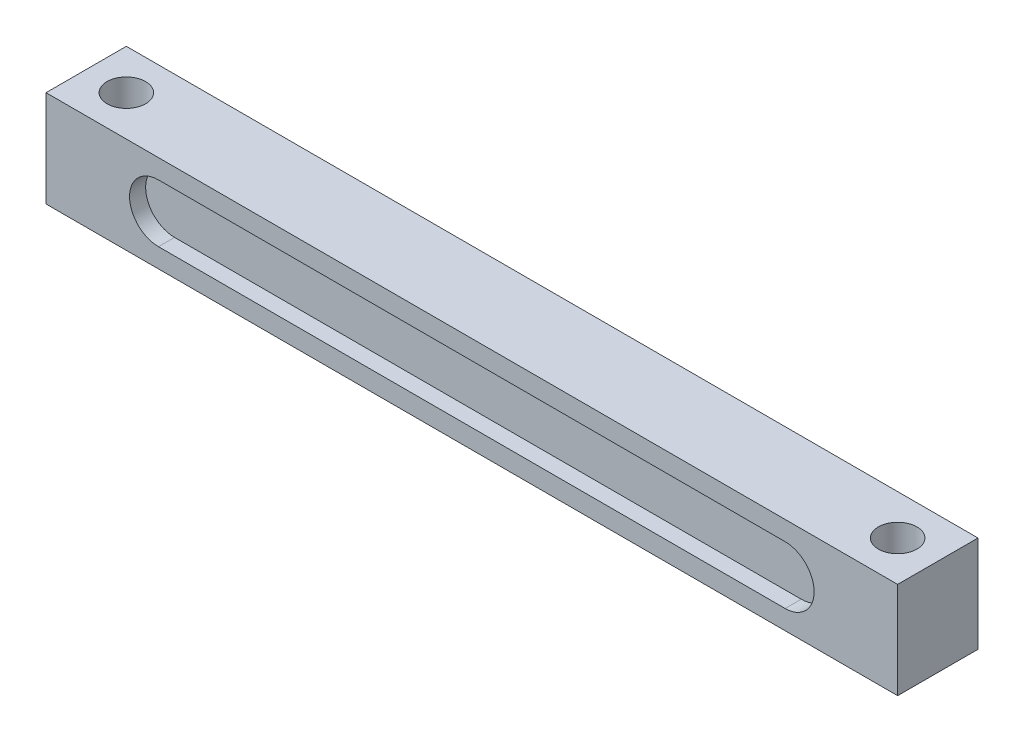
ISO-10303-21;
HEADER;
FILE_DESCRIPTION(('STEP AP214'),'2;1');
FILE_NAME('part.step','',(''),(''),'','','');
FILE_SCHEMA(('AUTOMOTIVE_DESIGN { 1 0 10303 214 1 1 1 1 }'));
ENDSEC;
DATA;
#1=APPLICATION_CONTEXT('core data for automotive mechanical design processes');
#2=APPLICATION_PROTOCOL_DEFINITION('international standard','automotive_design',2000,#1);
#3=PRODUCT_CONTEXT('',#1,'mechanical');
#4=PRODUCT('Part','Part','',(#3));
#5=PRODUCT_RELATED_PRODUCT_CATEGORY('part','',(#4));
#6=PRODUCT_DEFINITION_FORMATION('','',#4);
#7=PRODUCT_DEFINITION_CONTEXT('part definition',#1,'design');
#8=PRODUCT_DEFINITION('design','',#6,#7);
#9=PRODUCT_DEFINITION_SHAPE('','',#8);
#10=(LENGTH_UNIT() NAMED_UNIT(*) SI_UNIT(.MILLI.,.METRE.));
#11=(NAMED_UNIT(*) PLANE_ANGLE_UNIT() SI_UNIT($,.RADIAN.));
#12=(NAMED_UNIT(*) SI_UNIT($,.STERADIAN.) SOLID_ANGLE_UNIT());
#13=UNCERTAINTY_MEASURE_WITH_UNIT(LENGTH_MEASURE(1.E-05),#10,'distance_accuracy_value','');
#14=(GEOMETRIC_REPRESENTATION_CONTEXT(3) GLOBAL_UNCERTAINTY_ASSIGNED_CONTEXT((#13)) GLOBAL_UNIT_ASSIGNED_CONTEXT((#10,
#11,#12)) REPRESENTATION_CONTEXT('',''));
#15=CARTESIAN_POINT('',(0.,0.,0.));
#16=DIRECTION('',(0.,0.,1.));
#17=DIRECTION('',(1.,0.,0.));
#18=AXIS2_PLACEMENT_3D('',#15,#16,#17);
#19=CARTESIAN_POINT('',(0.,0.,0.));
#20=DIRECTION('',(0.,-1.,0.));
#21=DIRECTION('',(0.,0.,-1.));
#22=AXIS2_PLACEMENT_3D('',#19,#20,#21);
#23=PLANE('',#22);
#24=DIRECTION('',(-1.,0.,0.));
#25=VECTOR('',#24,1.);
#26=CARTESIAN_POINT('',(0.,0.,-31.75));
#27=LINE('',#26,#25);
#28=CARTESIAN_POINT('',(152.4,0.,-31.75));
#29=VERTEX_POINT('',#28);
#30=CARTESIAN_POINT('',(15.875,0.,-31.75));
#31=VERTEX_POINT('',#30);
#32=EDGE_CURVE('E274',#29,#31,#27,.T.);
#33=ORIENTED_EDGE('',*,*,#32,.F.);
#34=DIRECTION('',(0.,0.,1.));
#35=VECTOR('',#34,1.);
#36=CARTESIAN_POINT('',(152.4,0.,0.));
#37=LINE('',#36,#35);
#38=CARTESIAN_POINT('',(152.4,0.,0.));
#39=VERTEX_POINT('',#38);
#40=EDGE_CURVE('E11',#29,#39,#37,.T.);
#41=ORIENTED_EDGE('',*,*,#40,.T.);
#42=DIRECTION('',(1.,0.,0.));
#43=VECTOR('',#42,1.);
#44=CARTESIAN_POINT('',(0.,0.,0.));
#45=LINE('',#44,#43);
#46=CARTESIAN_POINT('',(15.875,0.,0.));
#47=VERTEX_POINT('',#46);
#48=EDGE_CURVE('E266',#47,#39,#45,.T.);
#49=ORIENTED_EDGE('',*,*,#48,.F.);
#50=CARTESIAN_POINT('',(15.875,0.,-15.875));
#51=DIRECTION('',(0.,-1.,0.));
#52=DIRECTION('',(0.,0.,-1.));
#53=AXIS2_PLACEMENT_3D('',#50,#51,#52);
#54=CIRCLE('',#53,15.875);
#55=EDGE_CURVE('E290',#47,#31,#54,.F.);
#56=ORIENTED_EDGE('',*,*,#55,.T.);
#57=EDGE_LOOP('',(#33,#41,#49,#56));
#58=FACE_BOUND('',#57,.T.);
#59=ADVANCED_FACE('F50',(#58),#23,.T.);
#60=CARTESIAN_POINT('',(184.15,0.,0.));
#61=VERTEX_POINT('',#60);
#62=CARTESIAN_POINT('',(320.675,0.,0.));
#63=VERTEX_POINT('',#62);
#64=EDGE_CURVE('E270',#61,#63,#45,.T.);
#65=ORIENTED_EDGE('',*,*,#64,.F.);
#66=DIRECTION('',(0.,0.,-1.));
#67=VECTOR('',#66,1.);
#68=CARTESIAN_POINT('',(184.15,0.,0.));
#69=LINE('',#68,#67);
#70=CARTESIAN_POINT('',(184.15,0.,-31.75));
#71=VERTEX_POINT('',#70);
#72=EDGE_CURVE('E57',#61,#71,#69,.T.);
#73=ORIENTED_EDGE('',*,*,#72,.T.);
#74=CARTESIAN_POINT('',(320.675,0.,-31.75));
#75=VERTEX_POINT('',#74);
#76=EDGE_CURVE('E273',#75,#71,#27,.T.);
#77=ORIENTED_EDGE('',*,*,#76,.F.);
#78=CARTESIAN_POINT('',(320.675,0.,-15.875));
#79=DIRECTION('',(0.,-1.,0.));
#80=DIRECTION('',(0.,0.,-1.));
#81=AXIS2_PLACEMENT_3D('',#78,#79,#80);
#82=CIRCLE('',#81,15.875);
#83=EDGE_CURVE('E299',#75,#63,#82,.F.);
#84=ORIENTED_EDGE('',*,*,#83,.T.);
#85=EDGE_LOOP('',(#65,#73,#77,#84));
#86=FACE_BOUND('',#85,.T.);
#87=ADVANCED_FACE('F344',(#86),#23,.T.);
#88=ORIENTED_EDGE('',*,*,#40,.F.);
#89=EDGE_CURVE('E342',#71,#29,#27,.T.);
#90=ORIENTED_EDGE('',*,*,#89,.F.);
#91=ORIENTED_EDGE('',*,*,#72,.F.);
#92=EDGE_CURVE('E333',#39,#61,#45,.T.);
#93=ORIENTED_EDGE('',*,*,#92,.F.);
#94=EDGE_LOOP('',(#88,#90,#91,#93));
#95=FACE_BOUND('',#94,.T.);
#96=ADVANCED_FACE('F336',(#95),#23,.T.);
#97=CARTESIAN_POINT('',(336.55,0.,0.));
#98=VERTEX_POINT('',#97);
#99=EDGE_CURVE('E261',#63,#98,#45,.T.);
#100=ORIENTED_EDGE('',*,*,#99,.F.);
#101=CARTESIAN_POINT('',(336.55,0.,-15.875));
#102=VERTEX_POINT('',#101);
#103=EDGE_CURVE('E298',#63,#102,#82,.F.);
#104=ORIENTED_EDGE('',*,*,#103,.T.);
#105=DIRECTION('',(0.,0.,-1.));
#106=VECTOR('',#105,1.);
#107=CARTESIAN_POINT('',(336.55,0.,0.));
#108=LINE('',#107,#106);
#109=EDGE_CURVE('E268',#98,#102,#108,.T.);
#110=ORIENTED_EDGE('',*,*,#109,.F.);
#111=EDGE_LOOP('',(#100,#104,#110));
#112=FACE_BOUND('',#111,.T.);
#113=ADVANCED_FACE('F317',(#112),#23,.T.);
#114=CARTESIAN_POINT('',(336.55,0.,-31.75));
#115=VERTEX_POINT('',#114);
#116=EDGE_CURVE('E264',#102,#115,#108,.T.);
#117=ORIENTED_EDGE('',*,*,#116,.F.);
#118=EDGE_CURVE('E291',#102,#75,#82,.F.);
#119=ORIENTED_EDGE('',*,*,#118,.T.);
#120=EDGE_CURVE('E253',#115,#75,#27,.T.);
#121=ORIENTED_EDGE('',*,*,#120,.F.);
#122=EDGE_LOOP('',(#117,#119,#121));
#123=FACE_BOUND('',#122,.T.);
#124=ADVANCED_FACE('F326',(#123),#23,.T.);
#125=CARTESIAN_POINT('',(0.,0.,-31.75));
#126=VERTEX_POINT('',#125);
#127=EDGE_CURVE('E271',#31,#126,#27,.T.);
#128=ORIENTED_EDGE('',*,*,#127,.F.);
#129=CARTESIAN_POINT('',(0.,0.,-15.875));
#130=VERTEX_POINT('',#129);
#131=EDGE_CURVE('E295',#31,#130,#54,.F.);
#132=ORIENTED_EDGE('',*,*,#131,.T.);
#133=DIRECTION('',(0.,0.,1.));
#134=VECTOR('',#133,1.);
#135=CARTESIAN_POINT('',(0.,0.,0.));
#136=LINE('',#135,#134);
#137=EDGE_CURVE('E256',#126,#130,#136,.T.);
#138=ORIENTED_EDGE('',*,*,#137,.F.);
#139=EDGE_LOOP('',(#128,#132,#138));
#140=FACE_BOUND('',#139,.T.);
#141=ADVANCED_FACE('F421',(#140),#23,.T.);
#142=CARTESIAN_POINT('',(0.,0.,0.));
#143=VERTEX_POINT('',#142);
#144=EDGE_CURVE('E245',#130,#143,#136,.T.);
#145=ORIENTED_EDGE('',*,*,#144,.F.);
#146=EDGE_CURVE('E292',#130,#47,#54,.F.);
#147=ORIENTED_EDGE('',*,*,#146,.T.);
#148=EDGE_CURVE('E265',#143,#47,#45,.T.);
#149=ORIENTED_EDGE('',*,*,#148,.F.);
#150=EDGE_LOOP('',(#145,#147,#149));
#151=FACE_BOUND('',#150,.T.);
#152=ADVANCED_FACE('F420',(#151),#23,.T.);
#153=ORIENTED_EDGE('',*,*,#83,.F.);
#154=ORIENTED_EDGE('',*,*,#118,.F.);
#155=ORIENTED_EDGE('',*,*,#103,.F.);
#156=EDGE_LOOP('',(#153,#154,#155));
#157=FACE_BOUND('',#156,.T.);
#158=CARTESIAN_POINT('',(320.675,0.,-15.875));
#159=DIRECTION('',(0.,1.,0.));
#160=DIRECTION('',(0.,0.,1.));
#161=AXIS2_PLACEMENT_3D('',#158,#159,#160);
#162=CIRCLE('',#161,7.62000000000003);
#163=CARTESIAN_POINT('',(320.675,0.,-23.495));
#164=VERTEX_POINT('',#163);
#165=EDGE_CURVE('E230',#164,#164,#162,.T.);
#166=ORIENTED_EDGE('',*,*,#165,.T.);
#167=EDGE_LOOP('',(#166));
#168=FACE_BOUND('',#167,.T.);
#169=ADVANCED_FACE('F325',(#157,#168),#23,.T.);
#170=CARTESIAN_POINT('',(0.,38.1,0.));
#171=DIRECTION('',(0.,-1.,0.));
#172=DIRECTION('',(0.,0.,-1.));
#173=AXIS2_PLACEMENT_3D('',#170,#171,#172);
#174=PLANE('',#173);
#175=DIRECTION('',(0.,0.,1.));
#176=VECTOR('',#175,1.);
#177=CARTESIAN_POINT('',(0.,38.1,0.));
#178=LINE('',#177,#176);
#179=CARTESIAN_POINT('',(0.,38.1,-31.75));
#180=VERTEX_POINT('',#179);
#181=CARTESIAN_POINT('',(0.,38.1,0.));
#182=VERTEX_POINT('',#181);
#183=EDGE_CURVE('E250',#180,#182,#178,.T.);
#184=ORIENTED_EDGE('',*,*,#183,.T.);
#185=DIRECTION('',(1.,0.,0.));
#186=VECTOR('',#185,1.);
#187=CARTESIAN_POINT('',(0.,38.1,0.));
#188=LINE('',#187,#186);
#189=CARTESIAN_POINT('',(336.55,38.1,0.));
#190=VERTEX_POINT('',#189);
#191=EDGE_CURVE('E249',#182,#190,#188,.T.);
#192=ORIENTED_EDGE('',*,*,#191,.T.);
#193=DIRECTION('',(0.,0.,-1.));
#194=VECTOR('',#193,1.);
#195=CARTESIAN_POINT('',(336.55,38.1,0.));
#196=LINE('',#195,#194);
#197=CARTESIAN_POINT('',(336.55,38.1,-31.75));
#198=VERTEX_POINT('',#197);
#199=EDGE_CURVE('E251',#190,#198,#196,.T.);
#200=ORIENTED_EDGE('',*,*,#199,.T.);
#201=DIRECTION('',(-1.,0.,0.));
#202=VECTOR('',#201,1.);
#203=CARTESIAN_POINT('',(0.,38.1,-31.75));
#204=LINE('',#203,#202);
#205=EDGE_CURVE('E254',#198,#180,#204,.T.);
#206=ORIENTED_EDGE('',*,*,#205,.T.);
#207=EDGE_LOOP('',(#184,#192,#200,#206));
#208=FACE_BOUND('',#207,.T.);
#209=CARTESIAN_POINT('',(15.875,38.1,-15.875));
#210=DIRECTION('',(0.,1.,0.));
#211=DIRECTION('',(0.,0.,1.));
#212=AXIS2_PLACEMENT_3D('',#209,#210,#211);
#213=CIRCLE('',#212,7.62);
#214=CARTESIAN_POINT('',(15.875,38.1,-23.495));
#215=VERTEX_POINT('',#214);
#216=EDGE_CURVE('E243',#215,#215,#213,.T.);
#217=ORIENTED_EDGE('',*,*,#216,.F.);
#218=EDGE_LOOP('',(#217));
#219=FACE_BOUND('',#218,.T.);
#220=CARTESIAN_POINT('',(320.675,38.1,-15.875));
#221=DIRECTION('',(0.,1.,0.));
#222=DIRECTION('',(0.,0.,1.));
#223=AXIS2_PLACEMENT_3D('',#220,#221,#222);
#224=CIRCLE('',#223,7.62000000000003);
#225=CARTESIAN_POINT('',(320.675,38.1,-23.495));
#226=VERTEX_POINT('',#225);
#227=EDGE_CURVE('E234',#226,#226,#224,.T.);
#228=ORIENTED_EDGE('',*,*,#227,.F.);
#229=EDGE_LOOP('',(#228));
#230=FACE_BOUND('',#229,.T.);
#231=ADVANCED_FACE('F360',(#208,#219,#230),#174,.F.);
#232=ORIENTED_EDGE('',*,*,#131,.F.);
#233=ORIENTED_EDGE('',*,*,#55,.F.);
#234=ORIENTED_EDGE('',*,*,#146,.F.);
#235=EDGE_LOOP('',(#232,#233,#234));
#236=FACE_BOUND('',#235,.T.);
#237=CARTESIAN_POINT('',(15.875,0.,-15.875));
#238=DIRECTION('',(0.,1.,0.));
#239=DIRECTION('',(0.,0.,1.));
#240=AXIS2_PLACEMENT_3D('',#237,#238,#239);
#241=CIRCLE('',#240,7.62);
#242=CARTESIAN_POINT('',(15.875,0.,-23.495));
#243=VERTEX_POINT('',#242);
#244=EDGE_CURVE('E236',#243,#243,#241,.T.);
#245=ORIENTED_EDGE('',*,*,#244,.T.);
#246=EDGE_LOOP('',(#245));
#247=FACE_BOUND('',#246,.T.);
#248=ADVANCED_FACE('F352',(#236,#247),#23,.T.);
#249=CARTESIAN_POINT('',(0.,38.1,0.));
#250=DIRECTION('',(1.,0.,0.));
#251=DIRECTION('',(0.,0.,-1.));
#252=AXIS2_PLACEMENT_3D('',#249,#250,#251);
#253=PLANE('',#252);
#254=ORIENTED_EDGE('',*,*,#137,.T.);
#255=ORIENTED_EDGE('',*,*,#144,.T.);
#256=DIRECTION('',(0.,-1.,0.));
#257=VECTOR('',#256,1.);
#258=CARTESIAN_POINT('',(0.,38.1,0.));
#259=LINE('',#258,#257);
#260=EDGE_CURVE('E285',#182,#143,#259,.T.);
#261=ORIENTED_EDGE('',*,*,#260,.F.);
#262=ORIENTED_EDGE('',*,*,#183,.F.);
#263=DIRECTION('',(0.,-1.,0.));
#264=VECTOR('',#263,1.);
#265=CARTESIAN_POINT('',(0.,38.1,-31.75));
#266=LINE('',#265,#264);
#267=EDGE_CURVE('E260',#180,#126,#266,.T.);
#268=ORIENTED_EDGE('',*,*,#267,.T.);
#269=EDGE_LOOP('',(#254,#255,#261,#262,#268));
#270=FACE_BOUND('',#269,.T.);
#271=ADVANCED_FACE('F47',(#270),#253,.F.);
#272=CARTESIAN_POINT('',(0.,38.1,0.));
#273=DIRECTION('',(0.,0.,-1.));
#274=DIRECTION('',(-1.,0.,0.));
#275=AXIS2_PLACEMENT_3D('',#272,#273,#274);
#276=PLANE('',#275);
#277=DIRECTION('',(1.,0.,0.));
#278=VECTOR('',#277,1.);
#279=CARTESIAN_POINT('',(44.45,7.62,0.));
#280=LINE('',#279,#278);
#281=CARTESIAN_POINT('',(44.45,7.62,0.));
#282=VERTEX_POINT('',#281);
#283=CARTESIAN_POINT('',(292.1,7.62,0.));
#284=VERTEX_POINT('',#283);
#285=EDGE_CURVE('E218',#282,#284,#280,.T.);
#286=ORIENTED_EDGE('',*,*,#285,.F.);
#287=CARTESIAN_POINT('',(44.45,19.05,0.));
#288=DIRECTION('',(0.,0.,1.));
#289=DIRECTION('',(1.,0.,0.));
#290=AXIS2_PLACEMENT_3D('',#287,#288,#289);
#291=CIRCLE('',#290,11.43);
#292=CARTESIAN_POINT('',(44.45,30.48,0.));
#293=VERTEX_POINT('',#292);
#294=EDGE_CURVE('E72',#293,#282,#291,.T.);
#295=ORIENTED_EDGE('',*,*,#294,.F.);
#296=DIRECTION('',(-1.,0.,0.));
#297=VECTOR('',#296,1.);
#298=CARTESIAN_POINT('',(44.45,30.48,0.));
#299=LINE('',#298,#297);
#300=CARTESIAN_POINT('',(292.1,30.48,0.));
#301=VERTEX_POINT('',#300);
#302=EDGE_CURVE('E208',#301,#293,#299,.T.);
#303=ORIENTED_EDGE('',*,*,#302,.F.);
#304=CARTESIAN_POINT('',(292.1,19.05,0.));
#305=DIRECTION('',(0.,0.,1.));
#306=DIRECTION('',(1.,0.,0.));
#307=AXIS2_PLACEMENT_3D('',#304,#305,#306);
#308=CIRCLE('',#307,11.43);
#309=EDGE_CURVE('E225',#284,#301,#308,.T.);
#310=ORIENTED_EDGE('',*,*,#309,.F.);
#311=EDGE_LOOP('',(#286,#295,#303,#310));
#312=FACE_BOUND('',#311,.T.);
#313=ORIENTED_EDGE('',*,*,#148,.T.);
#314=ORIENTED_EDGE('',*,*,#48,.T.);
#315=ORIENTED_EDGE('',*,*,#92,.T.);
#316=ORIENTED_EDGE('',*,*,#64,.T.);
#317=ORIENTED_EDGE('',*,*,#99,.T.);
#318=DIRECTION('',(0.,-1.,0.));
#319=VECTOR('',#318,1.);
#320=CARTESIAN_POINT('',(336.55,38.1,0.));
#321=LINE('',#320,#319);
#322=EDGE_CURVE('E283',#190,#98,#321,.T.);
#323=ORIENTED_EDGE('',*,*,#322,.F.);
#324=ORIENTED_EDGE('',*,*,#191,.F.);
#325=ORIENTED_EDGE('',*,*,#260,.T.);
#326=EDGE_LOOP('',(#313,#314,#315,#316,#317,#323,#324,#325));
#327=FACE_BOUND('',#326,.T.);
#328=ADVANCED_FACE('F334',(#312,#327),#276,.F.);
#329=CARTESIAN_POINT('',(336.55,38.1,0.));
#330=DIRECTION('',(-1.,0.,0.));
#331=DIRECTION('',(0.,0.,1.));
#332=AXIS2_PLACEMENT_3D('',#329,#330,#331);
#333=PLANE('',#332);
#334=ORIENTED_EDGE('',*,*,#109,.T.);
#335=ORIENTED_EDGE('',*,*,#116,.T.);
#336=DIRECTION('',(0.,-1.,0.));
#337=VECTOR('',#336,1.);
#338=CARTESIAN_POINT('',(336.55,38.1,-31.75));
#339=LINE('',#338,#337);
#340=EDGE_CURVE('E279',#198,#115,#339,.T.);
#341=ORIENTED_EDGE('',*,*,#340,.F.);
#342=ORIENTED_EDGE('',*,*,#199,.F.);
#343=ORIENTED_EDGE('',*,*,#322,.T.);
#344=EDGE_LOOP('',(#334,#335,#341,#342,#343));
#345=FACE_BOUND('',#344,.T.);
#346=ADVANCED_FACE('F328',(#345),#333,.F.);
#347=CARTESIAN_POINT('',(0.,38.1,-31.75));
#348=DIRECTION('',(0.,0.,1.));
#349=DIRECTION('',(1.,0.,0.));
#350=AXIS2_PLACEMENT_3D('',#347,#348,#349);
#351=PLANE('',#350);
#352=DIRECTION('',(-1.,0.,0.));
#353=VECTOR('',#352,1.);
#354=CARTESIAN_POINT('',(292.1,7.62,-31.75));
#355=LINE('',#354,#353);
#356=CARTESIAN_POINT('',(292.1,7.62,-31.75));
#357=VERTEX_POINT('',#356);
#358=CARTESIAN_POINT('',(44.45,7.62,-31.75));
#359=VERTEX_POINT('',#358);
#360=EDGE_CURVE('E194',#357,#359,#355,.T.);
#361=ORIENTED_EDGE('',*,*,#360,.F.);
#362=CARTESIAN_POINT('',(292.1,19.05,-31.75));
#363=DIRECTION('',(0.,0.,-1.));
#364=DIRECTION('',(-1.,0.,0.));
#365=AXIS2_PLACEMENT_3D('',#362,#363,#364);
#366=CIRCLE('',#365,11.43);
#367=CARTESIAN_POINT('',(292.1,30.48,-31.75));
#368=VERTEX_POINT('',#367);
#369=EDGE_CURVE('E62',#368,#357,#366,.T.);
#370=ORIENTED_EDGE('',*,*,#369,.F.);
#371=DIRECTION('',(1.,0.,0.));
#372=VECTOR('',#371,1.);
#373=CARTESIAN_POINT('',(292.1,30.48,-31.75));
#374=LINE('',#373,#372);
#375=CARTESIAN_POINT('',(44.45,30.48,-31.75));
#376=VERTEX_POINT('',#375);
#377=EDGE_CURVE('E188',#376,#368,#374,.T.);
#378=ORIENTED_EDGE('',*,*,#377,.F.);
#379=CARTESIAN_POINT('',(44.45,19.05,-31.75));
#380=DIRECTION('',(0.,0.,-1.));
#381=DIRECTION('',(-1.,0.,0.));
#382=AXIS2_PLACEMENT_3D('',#379,#380,#381);
#383=CIRCLE('',#382,11.43);
#384=EDGE_CURVE('E190',#359,#376,#383,.T.);
#385=ORIENTED_EDGE('',*,*,#384,.F.);
#386=EDGE_LOOP('',(#361,#370,#378,#385));
#387=FACE_BOUND('',#386,.T.);
#388=ORIENTED_EDGE('',*,*,#120,.T.);
#389=ORIENTED_EDGE('',*,*,#76,.T.);
#390=ORIENTED_EDGE('',*,*,#89,.T.);
#391=ORIENTED_EDGE('',*,*,#32,.T.);
#392=ORIENTED_EDGE('',*,*,#127,.T.);
#393=ORIENTED_EDGE('',*,*,#267,.F.);
#394=ORIENTED_EDGE('',*,*,#205,.F.);
#395=ORIENTED_EDGE('',*,*,#340,.T.);
#396=EDGE_LOOP('',(#388,#389,#390,#391,#392,#393,#394,#395));
#397=FACE_BOUND('',#396,.T.);
#398=ADVANCED_FACE('F359',(#387,#397),#351,.F.);
#399=CARTESIAN_POINT('',(15.875,38.1,-15.875));
#400=DIRECTION('',(0.,-1.,0.));
#401=DIRECTION('',(0.,0.,-1.));
#402=AXIS2_PLACEMENT_3D('',#399,#400,#401);
#403=CYLINDRICAL_SURFACE('',#402,7.62);
#404=CARTESIAN_POINT('',(15.875,38.1,-23.495));
#405=CARTESIAN_POINT('',(15.875,37.703125,-23.495));
#406=CARTESIAN_POINT('',(15.875,37.30625,-23.495));
#407=CARTESIAN_POINT('',(15.875,36.5125,-23.495));
#408=CARTESIAN_POINT('',(15.875,36.115625,-23.495));
#409=CARTESIAN_POINT('',(15.875,35.321875,-23.495));
#410=CARTESIAN_POINT('',(15.875,34.925,-23.495));
#411=CARTESIAN_POINT('',(15.875,34.13125,-23.495));
#412=CARTESIAN_POINT('',(15.875,33.734375,-23.495));
#413=CARTESIAN_POINT('',(15.875,32.940625,-23.495));
#414=CARTESIAN_POINT('',(15.875,32.54375,-23.495));
#415=CARTESIAN_POINT('',(15.875,31.75,-23.495));
#416=CARTESIAN_POINT('',(15.875,31.353125,-23.495));
#417=CARTESIAN_POINT('',(15.875,30.559375,-23.495));
#418=CARTESIAN_POINT('',(15.875,30.1625,-23.495));
#419=CARTESIAN_POINT('',(15.875,29.36875,-23.495));
#420=CARTESIAN_POINT('',(15.875,28.971875,-23.495));
#421=CARTESIAN_POINT('',(15.875,28.178125,-23.495));
#422=CARTESIAN_POINT('',(15.875,27.78125,-23.495));
#423=CARTESIAN_POINT('',(15.875,26.9875,-23.495));
#424=CARTESIAN_POINT('',(15.875,26.590625,-23.495));
#425=CARTESIAN_POINT('',(15.875,25.796875,-23.495));
#426=CARTESIAN_POINT('',(15.875,25.4,-23.495));
#427=CARTESIAN_POINT('',(15.875,24.60625,-23.495));
#428=CARTESIAN_POINT('',(15.875,24.209375,-23.495));
#429=CARTESIAN_POINT('',(15.875,23.415625,-23.495));
#430=CARTESIAN_POINT('',(15.875,23.01875,-23.495));
#431=CARTESIAN_POINT('',(15.875,22.225,-23.495));
#432=CARTESIAN_POINT('',(15.875,21.828125,-23.495));
#433=CARTESIAN_POINT('',(15.875,21.034375,-23.495));
#434=CARTESIAN_POINT('',(15.875,20.6375,-23.495));
#435=CARTESIAN_POINT('',(15.875,19.84375,-23.495));
#436=CARTESIAN_POINT('',(15.875,19.446875,-23.495));
#437=CARTESIAN_POINT('',(15.875,18.653125,-23.495));
#438=CARTESIAN_POINT('',(15.875,18.25625,-23.495));
#439=CARTESIAN_POINT('',(15.875,17.4625,-23.495));
#440=CARTESIAN_POINT('',(15.875,17.065625,-23.495));
#441=CARTESIAN_POINT('',(15.875,16.271875,-23.495));
#442=CARTESIAN_POINT('',(15.875,15.875,-23.495));
#443=CARTESIAN_POINT('',(15.875,15.08125,-23.495));
#444=CARTESIAN_POINT('',(15.875,14.684375,-23.495));
#445=CARTESIAN_POINT('',(15.875,13.890625,-23.495));
#446=CARTESIAN_POINT('',(15.875,13.49375,-23.495));
#447=CARTESIAN_POINT('',(15.875,12.7,-23.495));
#448=CARTESIAN_POINT('',(15.875,12.303125,-23.495));
#449=CARTESIAN_POINT('',(15.875,11.509375,-23.495));
#450=CARTESIAN_POINT('',(15.875,11.1125,-23.495));
#451=CARTESIAN_POINT('',(15.875,10.31875,-23.495));
#452=CARTESIAN_POINT('',(15.875,9.92187499999999,-23.495));
#453=CARTESIAN_POINT('',(15.875,9.128125,-23.495));
#454=CARTESIAN_POINT('',(15.875,8.73124999999999,-23.495));
#455=CARTESIAN_POINT('',(15.875,7.93749999999999,-23.495));
#456=CARTESIAN_POINT('',(15.875,7.54062499999999,-23.495));
#457=CARTESIAN_POINT('',(15.875,6.746875,-23.495));
#458=CARTESIAN_POINT('',(15.875,6.35,-23.495));
#459=CARTESIAN_POINT('',(15.875,5.55625,-23.495));
#460=CARTESIAN_POINT('',(15.875,5.159375,-23.495));
#461=CARTESIAN_POINT('',(15.875,4.365625,-23.495));
#462=CARTESIAN_POINT('',(15.875,3.96875,-23.495));
#463=CARTESIAN_POINT('',(15.875,3.175,-23.495));
#464=CARTESIAN_POINT('',(15.875,2.778125,-23.495));
#465=CARTESIAN_POINT('',(15.875,1.984375,-23.495));
#466=CARTESIAN_POINT('',(15.875,1.5875,-23.495));
#467=CARTESIAN_POINT('',(15.875,0.79375,-23.495));
#468=CARTESIAN_POINT('',(15.875,0.396875,-23.495));
#469=CARTESIAN_POINT('',(15.875,0.,-23.495));
#470=B_SPLINE_CURVE_WITH_KNOTS('',3,(#404,#405,#406,#407,#408,#409,#410,#411,#412,#413,#414,
#415,#416,#417,#418,#419,#420,#421,#422,#423,#424,#425,#426,#427,#428,#429,#430,#431,#432,#433,
#434,#435,#436,#437,#438,#439,#440,#441,#442,#443,#444,#445,#446,#447,#448,#449,#450,#451,#452,
#453,#454,#455,#456,#457,#458,#459,#460,#461,#462,#463,#464,#465,#466,#467,#468,#469),
.UNSPECIFIED.,.F.,.F.,(4,2,2,2,2,2,2,2,2,2,2,2,2,2,2,2,2,2,2,2,2,2,2,2,2,2,2,2,2,2,2,2,4),(0.,
1.190625,2.38125,3.571875,4.7625,5.953125,7.14375,8.334375,9.52500000000001,10.715625,11.90625,
13.096875,14.2875,15.478125,16.66875,17.859375,19.05,20.240625,21.43125,22.621875,23.8125,
25.003125,26.19375,27.384375,28.575,29.765625,30.95625,32.146875,33.3375,34.528125,35.71875,
36.909375,38.1),.UNSPECIFIED.);
#471=EDGE_CURVE('BSEAM361',#215,#243,#470,.T.);
#472=ORIENTED_EDGE('',*,*,#216,.T.);
#473=ORIENTED_EDGE('',*,*,#244,.F.);
#474=ORIENTED_EDGE('',*,*,#471,.T.);
#475=ORIENTED_EDGE('',*,*,#471,.F.);
#476=EDGE_LOOP('',(#472,#474,#473,#475));
#477=FACE_BOUND('',#476,.T.);
#478=ADVANCED_FACE('F361',(#477),#403,.F.);
#479=CARTESIAN_POINT('',(320.675,38.1,-15.875));
#480=DIRECTION('',(0.,-1.,0.));
#481=DIRECTION('',(0.,0.,-1.));
#482=AXIS2_PLACEMENT_3D('',#479,#480,#481);
#483=CYLINDRICAL_SURFACE('',#482,7.62000000000003);
#484=CARTESIAN_POINT('',(320.675,38.1,-23.495));
#485=CARTESIAN_POINT('',(320.675,37.703125,-23.495));
#486=CARTESIAN_POINT('',(320.675,37.30625,-23.495));
#487=CARTESIAN_POINT('',(320.675,36.5125,-23.495));
#488=CARTESIAN_POINT('',(320.675,36.115625,-23.495));
#489=CARTESIAN_POINT('',(320.675,35.321875,-23.495));
#490=CARTESIAN_POINT('',(320.675,34.925,-23.495));
#491=CARTESIAN_POINT('',(320.675,34.13125,-23.495));
#492=CARTESIAN_POINT('',(320.675,33.734375,-23.495));
#493=CARTESIAN_POINT('',(320.675,32.940625,-23.495));
#494=CARTESIAN_POINT('',(320.675,32.54375,-23.495));
#495=CARTESIAN_POINT('',(320.675,31.75,-23.495));
#496=CARTESIAN_POINT('',(320.675,31.353125,-23.495));
#497=CARTESIAN_POINT('',(320.675,30.559375,-23.495));
#498=CARTESIAN_POINT('',(320.675,30.1625,-23.495));
#499=CARTESIAN_POINT('',(320.675,29.36875,-23.495));
#500=CARTESIAN_POINT('',(320.675,28.971875,-23.495));
#501=CARTESIAN_POINT('',(320.675,28.178125,-23.495));
#502=CARTESIAN_POINT('',(320.675,27.78125,-23.495));
#503=CARTESIAN_POINT('',(320.675,26.9875,-23.495));
#504=CARTESIAN_POINT('',(320.675,26.590625,-23.495));
#505=CARTESIAN_POINT('',(320.675,25.796875,-23.495));
#506=CARTESIAN_POINT('',(320.675,25.4,-23.495));
#507=CARTESIAN_POINT('',(320.675,24.60625,-23.495));
#508=CARTESIAN_POINT('',(320.675,24.209375,-23.495));
#509=CARTESIAN_POINT('',(320.675,23.415625,-23.495));
#510=CARTESIAN_POINT('',(320.675,23.01875,-23.495));
#511=CARTESIAN_POINT('',(320.675,22.225,-23.495));
#512=CARTESIAN_POINT('',(320.675,21.828125,-23.495));
#513=CARTESIAN_POINT('',(320.675,21.034375,-23.495));
#514=CARTESIAN_POINT('',(320.675,20.6375,-23.495));
#515=CARTESIAN_POINT('',(320.675,19.84375,-23.495));
#516=CARTESIAN_POINT('',(320.675,19.446875,-23.495));
#517=CARTESIAN_POINT('',(320.675,18.653125,-23.495));
#518=CARTESIAN_POINT('',(320.675,18.25625,-23.495));
#519=CARTESIAN_POINT('',(320.675,17.4625,-23.495));
#520=CARTESIAN_POINT('',(320.675,17.065625,-23.495));
#521=CARTESIAN_POINT('',(320.675,16.271875,-23.495));
#522=CARTESIAN_POINT('',(320.675,15.875,-23.495));
#523=CARTESIAN_POINT('',(320.675,15.08125,-23.495));
#524=CARTESIAN_POINT('',(320.675,14.684375,-23.495));
#525=CARTESIAN_POINT('',(320.675,13.890625,-23.495));
#526=CARTESIAN_POINT('',(320.675,13.49375,-23.495));
#527=CARTESIAN_POINT('',(320.675,12.7,-23.495));
#528=CARTESIAN_POINT('',(320.675,12.303125,-23.495));
#529=CARTESIAN_POINT('',(320.675,11.509375,-23.495));
#530=CARTESIAN_POINT('',(320.675,11.1125,-23.495));
#531=CARTESIAN_POINT('',(320.675,10.31875,-23.495));
#532=CARTESIAN_POINT('',(320.675,9.92187499999999,-23.495));
#533=CARTESIAN_POINT('',(320.675,9.128125,-23.495));
#534=CARTESIAN_POINT('',(320.675,8.73124999999999,-23.495));
#535=CARTESIAN_POINT('',(320.675,7.93749999999999,-23.495));
#536=CARTESIAN_POINT('',(320.675,7.54062499999999,-23.495));
#537=CARTESIAN_POINT('',(320.675,6.746875,-23.495));
#538=CARTESIAN_POINT('',(320.675,6.35,-23.495));
#539=CARTESIAN_POINT('',(320.675,5.55625,-23.495));
#540=CARTESIAN_POINT('',(320.675,5.159375,-23.495));
#541=CARTESIAN_POINT('',(320.675,4.365625,-23.495));
#542=CARTESIAN_POINT('',(320.675,3.96875,-23.495));
#543=CARTESIAN_POINT('',(320.675,3.175,-23.495));
#544=CARTESIAN_POINT('',(320.675,2.778125,-23.495));
#545=CARTESIAN_POINT('',(320.675,1.984375,-23.495));
#546=CARTESIAN_POINT('',(320.675,1.5875,-23.495));
#547=CARTESIAN_POINT('',(320.675,0.79375,-23.495));
#548=CARTESIAN_POINT('',(320.675,0.396875,-23.495));
#549=CARTESIAN_POINT('',(320.675,0.,-23.495));
#550=B_SPLINE_CURVE_WITH_KNOTS('',3,(#484,#485,#486,#487,#488,#489,#490,#491,#492,#493,#494,
#495,#496,#497,#498,#499,#500,#501,#502,#503,#504,#505,#506,#507,#508,#509,#510,#511,#512,#513,
#514,#515,#516,#517,#518,#519,#520,#521,#522,#523,#524,#525,#526,#527,#528,#529,#530,#531,#532,
#533,#534,#535,#536,#537,#538,#539,#540,#541,#542,#543,#544,#545,#546,#547,#548,#549),
.UNSPECIFIED.,.F.,.F.,(4,2,2,2,2,2,2,2,2,2,2,2,2,2,2,2,2,2,2,2,2,2,2,2,2,2,2,2,2,2,2,2,4),(0.,
1.190625,2.38125,3.571875,4.7625,5.953125,7.14375,8.334375,9.52500000000001,10.715625,11.90625,
13.096875,14.2875,15.478125,16.66875,17.859375,19.05,20.240625,21.43125,22.621875,23.8125,
25.003125,26.19375,27.384375,28.575,29.765625,30.95625,32.146875,33.3375,34.528125,35.71875,
36.909375,38.1),.UNSPECIFIED.);
#551=EDGE_CURVE('BSEAM399',#226,#164,#550,.T.);
#552=ORIENTED_EDGE('',*,*,#227,.T.);
#553=ORIENTED_EDGE('',*,*,#165,.F.);
#554=ORIENTED_EDGE('',*,*,#551,.T.);
#555=ORIENTED_EDGE('',*,*,#551,.F.);
#556=EDGE_LOOP('',(#552,#554,#553,#555));
#557=FACE_BOUND('',#556,.T.);
#558=ADVANCED_FACE('F399',(#557),#483,.F.);
#559=CARTESIAN_POINT('',(44.45,19.05,-6.35));
#560=DIRECTION('',(0.,0.,1.));
#561=DIRECTION('',(1.,0.,0.));
#562=AXIS2_PLACEMENT_3D('',#559,#560,#561);
#563=CYLINDRICAL_SURFACE('',#562,11.43);
#564=ORIENTED_EDGE('',*,*,#294,.T.);
#565=DIRECTION('',(0.,0.,1.));
#566=VECTOR('',#565,1.);
#567=CARTESIAN_POINT('',(44.45,7.62,-6.35));
#568=LINE('',#567,#566);
#569=CARTESIAN_POINT('',(44.45,7.62,-6.35));
#570=VERTEX_POINT('',#569);
#571=EDGE_CURVE('E220',#570,#282,#568,.T.);
#572=ORIENTED_EDGE('',*,*,#571,.F.);
#573=CARTESIAN_POINT('',(44.45,19.05,-6.35));
#574=DIRECTION('',(0.,0.,1.));
#575=DIRECTION('',(1.,0.,0.));
#576=AXIS2_PLACEMENT_3D('',#573,#574,#575);
#577=CIRCLE('',#576,11.43);
#578=CARTESIAN_POINT('',(44.45,30.48,-6.35));
#579=VERTEX_POINT('',#578);
#580=EDGE_CURVE('E204',#579,#570,#577,.T.);
#581=ORIENTED_EDGE('',*,*,#580,.F.);
#582=DIRECTION('',(0.,0.,1.));
#583=VECTOR('',#582,1.);
#584=CARTESIAN_POINT('',(44.45,30.48,-6.35));
#585=LINE('',#584,#583);
#586=EDGE_CURVE('E229',#579,#293,#585,.T.);
#587=ORIENTED_EDGE('',*,*,#586,.T.);
#588=EDGE_LOOP('',(#564,#572,#581,#587));
#589=FACE_BOUND('',#588,.T.);
#590=ADVANCED_FACE('F381',(#589),#563,.F.);
#591=CARTESIAN_POINT('',(44.45,30.48,-6.35));
#592=DIRECTION('',(0.,1.,0.));
#593=DIRECTION('',(0.,0.,1.));
#594=AXIS2_PLACEMENT_3D('',#591,#592,#593);
#595=PLANE('',#594);
#596=ORIENTED_EDGE('',*,*,#302,.T.);
#597=ORIENTED_EDGE('',*,*,#586,.F.);
#598=DIRECTION('',(-1.,0.,0.));
#599=VECTOR('',#598,1.);
#600=CARTESIAN_POINT('',(44.45,30.48,-6.35));
#601=LINE('',#600,#599);
#602=CARTESIAN_POINT('',(292.1,30.48,-6.35));
#603=VERTEX_POINT('',#602);
#604=EDGE_CURVE('E212',#603,#579,#601,.T.);
#605=ORIENTED_EDGE('',*,*,#604,.F.);
#606=DIRECTION('',(0.,0.,1.));
#607=VECTOR('',#606,1.);
#608=CARTESIAN_POINT('',(292.1,30.48,-6.35));
#609=LINE('',#608,#607);
#610=EDGE_CURVE('E226',#603,#301,#609,.T.);
#611=ORIENTED_EDGE('',*,*,#610,.T.);
#612=EDGE_LOOP('',(#596,#597,#605,#611));
#613=FACE_BOUND('',#612,.T.);
#614=ADVANCED_FACE('F387',(#613),#595,.F.);
#615=CARTESIAN_POINT('',(292.1,19.05,-6.35));
#616=DIRECTION('',(0.,0.,1.));
#617=DIRECTION('',(1.,0.,0.));
#618=AXIS2_PLACEMENT_3D('',#615,#616,#617);
#619=CYLINDRICAL_SURFACE('',#618,11.43);
#620=ORIENTED_EDGE('',*,*,#309,.T.);
#621=ORIENTED_EDGE('',*,*,#610,.F.);
#622=CARTESIAN_POINT('',(292.1,19.05,-6.35));
#623=DIRECTION('',(0.,0.,1.));
#624=DIRECTION('',(1.,0.,0.));
#625=AXIS2_PLACEMENT_3D('',#622,#623,#624);
#626=CIRCLE('',#625,11.43);
#627=CARTESIAN_POINT('',(292.1,7.62,-6.35));
#628=VERTEX_POINT('',#627);
#629=EDGE_CURVE('E211',#628,#603,#626,.T.);
#630=ORIENTED_EDGE('',*,*,#629,.F.);
#631=DIRECTION('',(0.,0.,1.));
#632=VECTOR('',#631,1.);
#633=CARTESIAN_POINT('',(292.1,7.62,-6.35));
#634=LINE('',#633,#632);
#635=EDGE_CURVE('E235',#628,#284,#634,.T.);
#636=ORIENTED_EDGE('',*,*,#635,.T.);
#637=EDGE_LOOP('',(#620,#621,#630,#636));
#638=FACE_BOUND('',#637,.T.);
#639=ADVANCED_FACE('F389',(#638),#619,.F.);
#640=CARTESIAN_POINT('',(44.45,7.62,-6.35));
#641=DIRECTION('',(0.,-1.,0.));
#642=DIRECTION('',(0.,0.,-1.));
#643=AXIS2_PLACEMENT_3D('',#640,#641,#642);
#644=PLANE('',#643);
#645=ORIENTED_EDGE('',*,*,#285,.T.);
#646=ORIENTED_EDGE('',*,*,#635,.F.);
#647=DIRECTION('',(1.,0.,0.));
#648=VECTOR('',#647,1.);
#649=CARTESIAN_POINT('',(44.45,7.62,-6.35));
#650=LINE('',#649,#648);
#651=EDGE_CURVE('E210',#570,#628,#650,.T.);
#652=ORIENTED_EDGE('',*,*,#651,.F.);
#653=ORIENTED_EDGE('',*,*,#571,.T.);
#654=EDGE_LOOP('',(#645,#646,#652,#653));
#655=FACE_BOUND('',#654,.T.);
#656=ADVANCED_FACE('F380',(#655),#644,.F.);
#657=CARTESIAN_POINT('',(44.45,19.05,-6.35));
#658=DIRECTION('',(0.,0.,1.));
#659=DIRECTION('',(1.,0.,0.));
#660=AXIS2_PLACEMENT_3D('',#657,#658,#659);
#661=PLANE('',#660);
#662=ORIENTED_EDGE('',*,*,#580,.T.);
#663=ORIENTED_EDGE('',*,*,#651,.T.);
#664=ORIENTED_EDGE('',*,*,#629,.T.);
#665=ORIENTED_EDGE('',*,*,#604,.T.);
#666=EDGE_LOOP('',(#662,#663,#664,#665));
#667=FACE_BOUND('',#666,.T.);
#668=ADVANCED_FACE('F383',(#667),#661,.T.);
#669=CARTESIAN_POINT('',(292.1,19.05,-25.4));
#670=DIRECTION('',(0.,0.,-1.));
#671=DIRECTION('',(-1.,0.,0.));
#672=AXIS2_PLACEMENT_3D('',#669,#670,#671);
#673=CYLINDRICAL_SURFACE('',#672,11.43);
#674=ORIENTED_EDGE('',*,*,#369,.T.);
#675=DIRECTION('',(0.,0.,-1.));
#676=VECTOR('',#675,1.);
#677=CARTESIAN_POINT('',(292.1,7.62,-25.4));
#678=LINE('',#677,#676);
#679=CARTESIAN_POINT('',(292.1,7.62,-25.4));
#680=VERTEX_POINT('',#679);
#681=EDGE_CURVE('E163',#680,#357,#678,.T.);
#682=ORIENTED_EDGE('',*,*,#681,.F.);
#683=CARTESIAN_POINT('',(292.1,19.05,-25.4));
#684=DIRECTION('',(0.,0.,-1.));
#685=DIRECTION('',(-1.,0.,0.));
#686=AXIS2_PLACEMENT_3D('',#683,#684,#685);
#687=CIRCLE('',#686,11.43);
#688=CARTESIAN_POINT('',(292.1,30.48,-25.4));
#689=VERTEX_POINT('',#688);
#690=EDGE_CURVE('E169',#689,#680,#687,.T.);
#691=ORIENTED_EDGE('',*,*,#690,.F.);
#692=DIRECTION('',(0.,0.,-1.));
#693=VECTOR('',#692,1.);
#694=CARTESIAN_POINT('',(292.1,30.48,-25.4));
#695=LINE('',#694,#693);
#696=EDGE_CURVE('E200',#689,#368,#695,.T.);
#697=ORIENTED_EDGE('',*,*,#696,.T.);
#698=EDGE_LOOP('',(#674,#682,#691,#697));
#699=FACE_BOUND('',#698,.T.);
#700=ADVANCED_FACE('F167',(#699),#673,.F.);
#701=CARTESIAN_POINT('',(292.1,30.48,-25.4));
#702=DIRECTION('',(0.,1.,0.));
#703=DIRECTION('',(0.,0.,1.));
#704=AXIS2_PLACEMENT_3D('',#701,#702,#703);
#705=PLANE('',#704);
#706=ORIENTED_EDGE('',*,*,#377,.T.);
#707=ORIENTED_EDGE('',*,*,#696,.F.);
#708=DIRECTION('',(1.,0.,0.));
#709=VECTOR('',#708,1.);
#710=CARTESIAN_POINT('',(292.1,30.48,-25.4));
#711=LINE('',#710,#709);
#712=CARTESIAN_POINT('',(44.45,30.48,-25.4));
#713=VERTEX_POINT('',#712);
#714=EDGE_CURVE('E175',#713,#689,#711,.T.);
#715=ORIENTED_EDGE('',*,*,#714,.F.);
#716=DIRECTION('',(0.,0.,-1.));
#717=VECTOR('',#716,1.);
#718=CARTESIAN_POINT('',(44.45,30.48,-25.4));
#719=LINE('',#718,#717);
#720=EDGE_CURVE('E203',#713,#376,#719,.T.);
#721=ORIENTED_EDGE('',*,*,#720,.T.);
#722=EDGE_LOOP('',(#706,#707,#715,#721));
#723=FACE_BOUND('',#722,.T.);
#724=ADVANCED_FACE('F567',(#723),#705,.F.);
#725=CARTESIAN_POINT('',(44.45,19.05,-25.4));
#726=DIRECTION('',(0.,0.,-1.));
#727=DIRECTION('',(-1.,0.,0.));
#728=AXIS2_PLACEMENT_3D('',#725,#726,#727);
#729=CYLINDRICAL_SURFACE('',#728,11.43);
#730=ORIENTED_EDGE('',*,*,#384,.T.);
#731=ORIENTED_EDGE('',*,*,#720,.F.);
#732=CARTESIAN_POINT('',(44.45,19.05,-25.4));
#733=DIRECTION('',(0.,0.,-1.));
#734=DIRECTION('',(-1.,0.,0.));
#735=AXIS2_PLACEMENT_3D('',#732,#733,#734);
#736=CIRCLE('',#735,11.43);
#737=CARTESIAN_POINT('',(44.45,7.62,-25.4));
#738=VERTEX_POINT('',#737);
#739=EDGE_CURVE('E185',#738,#713,#736,.T.);
#740=ORIENTED_EDGE('',*,*,#739,.F.);
#741=DIRECTION('',(0.,0.,-1.));
#742=VECTOR('',#741,1.);
#743=CARTESIAN_POINT('',(44.45,7.62,-25.4));
#744=LINE('',#743,#742);
#745=EDGE_CURVE('E172',#738,#359,#744,.T.);
#746=ORIENTED_EDGE('',*,*,#745,.T.);
#747=EDGE_LOOP('',(#730,#731,#740,#746));
#748=FACE_BOUND('',#747,.T.);
#749=ADVANCED_FACE('F575',(#748),#729,.F.);
#750=CARTESIAN_POINT('',(292.1,7.62,-25.4));
#751=DIRECTION('',(0.,-1.,0.));
#752=DIRECTION('',(0.,0.,-1.));
#753=AXIS2_PLACEMENT_3D('',#750,#751,#752);
#754=PLANE('',#753);
#755=ORIENTED_EDGE('',*,*,#360,.T.);
#756=ORIENTED_EDGE('',*,*,#745,.F.);
#757=DIRECTION('',(-1.,0.,0.));
#758=VECTOR('',#757,1.);
#759=CARTESIAN_POINT('',(292.1,7.62,-25.4));
#760=LINE('',#759,#758);
#761=EDGE_CURVE('E180',#680,#738,#760,.T.);
#762=ORIENTED_EDGE('',*,*,#761,.F.);
#763=ORIENTED_EDGE('',*,*,#681,.T.);
#764=EDGE_LOOP('',(#755,#756,#762,#763));
#765=FACE_BOUND('',#764,.T.);
#766=ADVANCED_FACE('F177',(#765),#754,.F.);
#767=CARTESIAN_POINT('',(292.1,19.05,-25.4));
#768=DIRECTION('',(0.,0.,-1.));
#769=DIRECTION('',(-1.,0.,0.));
#770=AXIS2_PLACEMENT_3D('',#767,#768,#769);
#771=PLANE('',#770);
#772=ORIENTED_EDGE('',*,*,#690,.T.);
#773=ORIENTED_EDGE('',*,*,#761,.T.);
#774=ORIENTED_EDGE('',*,*,#739,.T.);
#775=ORIENTED_EDGE('',*,*,#714,.T.);
#776=EDGE_LOOP('',(#772,#773,#774,#775));
#777=FACE_BOUND('',#776,.T.);
#778=ADVANCED_FACE('F184',(#777),#771,.T.);
#779=CLOSED_SHELL('',(#59,#87,#96,#113,#124,#141,#152,#169,#231,#248,#271,#328,#346,#398,#478,
#558,#590,#614,#639,#656,#668,#700,#724,#749,#766,#778));
#780=MANIFOLD_SOLID_BREP('B2',#779);
#781=ADVANCED_BREP_SHAPE_REPRESENTATION('',(#18,#780),#14);
#782=SHAPE_DEFINITION_REPRESENTATION(#9,#781);
ENDSEC;
END-ISO-10303-21;
